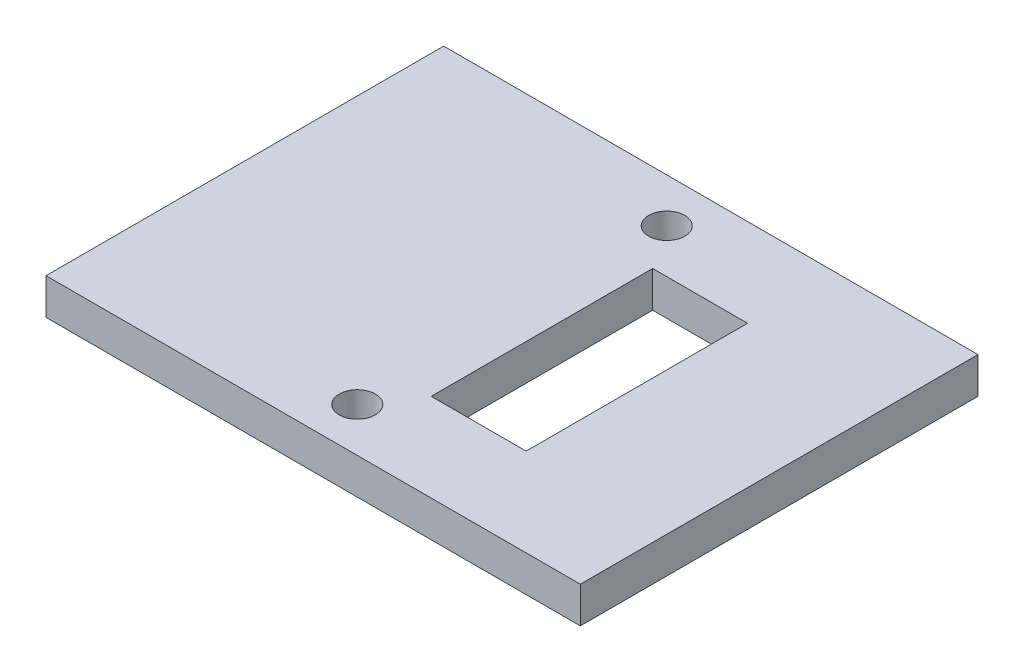
ISO-10303-21;
HEADER;
FILE_DESCRIPTION(('STEP AP214'),'2;1');
FILE_NAME('part.step','',(''),(''),'','','');
FILE_SCHEMA(('AUTOMOTIVE_DESIGN { 1 0 10303 214 1 1 1 1 }'));
ENDSEC;
DATA;
#1=APPLICATION_CONTEXT('core data for automotive mechanical design processes');
#2=APPLICATION_PROTOCOL_DEFINITION('international standard','automotive_design',2000,#1);
#3=PRODUCT_CONTEXT('',#1,'mechanical');
#4=PRODUCT('Part','Part','',(#3));
#5=PRODUCT_RELATED_PRODUCT_CATEGORY('part','',(#4));
#6=PRODUCT_DEFINITION_FORMATION('','',#4);
#7=PRODUCT_DEFINITION_CONTEXT('part definition',#1,'design');
#8=PRODUCT_DEFINITION('design','',#6,#7);
#9=PRODUCT_DEFINITION_SHAPE('','',#8);
#10=(LENGTH_UNIT() NAMED_UNIT(*) SI_UNIT(.MILLI.,.METRE.));
#11=(NAMED_UNIT(*) PLANE_ANGLE_UNIT() SI_UNIT($,.RADIAN.));
#12=(NAMED_UNIT(*) SI_UNIT($,.STERADIAN.) SOLID_ANGLE_UNIT());
#13=UNCERTAINTY_MEASURE_WITH_UNIT(LENGTH_MEASURE(1.E-05),#10,'distance_accuracy_value','');
#14=(GEOMETRIC_REPRESENTATION_CONTEXT(3) GLOBAL_UNCERTAINTY_ASSIGNED_CONTEXT((#13)) GLOBAL_UNIT_ASSIGNED_CONTEXT((#10,
#11,#12)) REPRESENTATION_CONTEXT('',''));
#15=CARTESIAN_POINT('',(0.,0.,0.));
#16=DIRECTION('',(0.,0.,1.));
#17=DIRECTION('',(1.,0.,0.));
#18=AXIS2_PLACEMENT_3D('',#15,#16,#17);
#19=CARTESIAN_POINT('',(4.255,1.,-5.50000000000001));
#20=DIRECTION('',(1.,0.,0.));
#21=DIRECTION('',(0.,0.,-1.));
#22=AXIS2_PLACEMENT_3D('',#19,#20,#21);
#23=PLANE('',#22);
#24=CARTESIAN_POINT('',(4.255,1.,-5.50000000000001));
#25=DIRECTION('',(-1.,0.,0.));
#26=DIRECTION('',(0.,0.,-1.));
#27=AXIS2_PLACEMENT_3D('',#24,#25,#26);
#28=CIRCLE('',#27,0.75);
#29=CARTESIAN_POINT('',(4.255,1.,-6.25000000000001));
#30=VERTEX_POINT('',#29);
#31=EDGE_CURVE('E395',#30,#30,#28,.T.);
#32=ORIENTED_EDGE('',*,*,#31,.T.);
#33=EDGE_LOOP('',(#32));
#34=FACE_BOUND('',#33,.T.);
#35=ADVANCED_FACE('F35',(#34),#23,.F.);
#36=CARTESIAN_POINT('',(4.25499999999999,1.,5.50000000000001));
#37=DIRECTION('',(-1.,0.,0.));
#38=DIRECTION('',(0.,0.,1.));
#39=AXIS2_PLACEMENT_3D('',#36,#37,#38);
#40=PLANE('',#39);
#41=CARTESIAN_POINT('',(4.25499999999999,1.,5.50000000000001));
#42=DIRECTION('',(-1.,0.,0.));
#43=DIRECTION('',(0.,0.,1.));
#44=AXIS2_PLACEMENT_3D('',#41,#42,#43);
#45=CIRCLE('',#44,0.75);
#46=CARTESIAN_POINT('',(4.25499999999999,1.,6.25000000000001));
#47=VERTEX_POINT('',#46);
#48=EDGE_CURVE('E389',#47,#47,#45,.T.);
#49=ORIENTED_EDGE('',*,*,#48,.T.);
#50=EDGE_LOOP('',(#49));
#51=FACE_BOUND('',#50,.T.);
#52=ADVANCED_FACE('F345',(#51),#40,.T.);
#53=CARTESIAN_POINT('',(2.21499999999999,0.,0.));
#54=DIRECTION('',(-1.,0.,0.));
#55=DIRECTION('',(0.,0.,1.));
#56=AXIS2_PLACEMENT_3D('',#53,#54,#55);
#57=PLANE('',#56);
#58=DIRECTION('',(0.,-1.,0.));
#59=VECTOR('',#58,1.);
#60=CARTESIAN_POINT('',(2.21499999999999,0.,-8.12500000000001));
#61=LINE('',#60,#59);
#62=CARTESIAN_POINT('',(2.21499999999999,0.,-8.12500000000001));
#63=VERTEX_POINT('',#62);
#64=CARTESIAN_POINT('',(2.21499999999999,-1.,-8.12500000000001));
#65=VERTEX_POINT('',#64);
#66=EDGE_CURVE('E238',#63,#65,#61,.T.);
#67=ORIENTED_EDGE('',*,*,#66,.F.);
#68=DIRECTION('',(0.,0.,1.));
#69=VECTOR('',#68,1.);
#70=CARTESIAN_POINT('',(2.21499999999999,0.,0.));
#71=LINE('',#70,#69);
#72=CARTESIAN_POINT('',(2.21499999999999,0.,-4.87500000000002));
#73=VERTEX_POINT('',#72);
#74=EDGE_CURVE('E224',#63,#73,#71,.T.);
#75=ORIENTED_EDGE('',*,*,#74,.T.);
#76=DIRECTION('',(0.,1.,0.));
#77=VECTOR('',#76,1.);
#78=CARTESIAN_POINT('',(2.21499999999999,0.,-4.87500000000002));
#79=LINE('',#78,#77);
#80=CARTESIAN_POINT('',(2.21499999999999,-1.,-4.87500000000002));
#81=VERTEX_POINT('',#80);
#82=EDGE_CURVE('E248',#81,#73,#79,.T.);
#83=ORIENTED_EDGE('',*,*,#82,.F.);
#84=DIRECTION('',(0.,0.,1.));
#85=VECTOR('',#84,1.);
#86=CARTESIAN_POINT('',(2.21499999999999,-1.,-8.12500000000001));
#87=LINE('',#86,#85);
#88=EDGE_CURVE('E247',#65,#81,#87,.T.);
#89=ORIENTED_EDGE('',*,*,#88,.F.);
#90=EDGE_LOOP('',(#67,#75,#83,#89));
#91=FACE_BOUND('',#90,.T.);
#92=ADVANCED_FACE('F243',(#91),#57,.F.);
#93=CARTESIAN_POINT('',(2.215,0.,0.));
#94=DIRECTION('',(1.,0.,0.));
#95=DIRECTION('',(0.,0.,-1.));
#96=AXIS2_PLACEMENT_3D('',#93,#94,#95);
#97=PLANE('',#96);
#98=DIRECTION('',(0.,0.,-1.));
#99=VECTOR('',#98,1.);
#100=CARTESIAN_POINT('',(2.215,0.,0.));
#101=LINE('',#100,#99);
#102=CARTESIAN_POINT('',(2.215,0.,8.12500000000001));
#103=VERTEX_POINT('',#102);
#104=CARTESIAN_POINT('',(2.215,0.,4.87500000000002));
#105=VERTEX_POINT('',#104);
#106=EDGE_CURVE('E177',#103,#105,#101,.T.);
#107=ORIENTED_EDGE('',*,*,#106,.F.);
#108=DIRECTION('',(0.,1.,0.));
#109=VECTOR('',#108,1.);
#110=CARTESIAN_POINT('',(2.215,0.,8.12500000000001));
#111=LINE('',#110,#109);
#112=CARTESIAN_POINT('',(2.215,-1.,8.12500000000001));
#113=VERTEX_POINT('',#112);
#114=EDGE_CURVE('E363',#113,#103,#111,.T.);
#115=ORIENTED_EDGE('',*,*,#114,.F.);
#116=DIRECTION('',(0.,0.,1.));
#117=VECTOR('',#116,1.);
#118=CARTESIAN_POINT('',(2.215,-1.,8.12500000000001));
#119=LINE('',#118,#117);
#120=CARTESIAN_POINT('',(2.215,-1.,4.87500000000002));
#121=VERTEX_POINT('',#120);
#122=EDGE_CURVE('E370',#121,#113,#119,.T.);
#123=ORIENTED_EDGE('',*,*,#122,.F.);
#124=DIRECTION('',(0.,-1.,0.));
#125=VECTOR('',#124,1.);
#126=CARTESIAN_POINT('',(2.215,0.,4.87500000000002));
#127=LINE('',#126,#125);
#128=EDGE_CURVE('E369',#105,#121,#127,.T.);
#129=ORIENTED_EDGE('',*,*,#128,.F.);
#130=EDGE_LOOP('',(#107,#115,#123,#129));
#131=FACE_BOUND('',#130,.T.);
#132=ADVANCED_FACE('F309',(#131),#97,.T.);
#133=CARTESIAN_POINT('',(10.69,2.,-6.125));
#134=DIRECTION('',(0.,0.,1.));
#135=DIRECTION('',(1.,0.,0.));
#136=AXIS2_PLACEMENT_3D('',#133,#134,#135);
#137=PLANE('',#136);
#138=DIRECTION('',(1.,0.,0.));
#139=VECTOR('',#138,1.);
#140=CARTESIAN_POINT('',(10.69,2.,-6.125));
#141=LINE('',#140,#139);
#142=CARTESIAN_POINT('',(10.69,2.,-6.125));
#143=VERTEX_POINT('',#142);
#144=CARTESIAN_POINT('',(15.94,2.,-6.125));
#145=VERTEX_POINT('',#144);
#146=EDGE_CURVE('E44',#143,#145,#141,.T.);
#147=ORIENTED_EDGE('',*,*,#146,.F.);
#148=DIRECTION('',(0.,-1.,0.));
#149=VECTOR('',#148,1.);
#150=CARTESIAN_POINT('',(10.69,2.,-6.125));
#151=LINE('',#150,#149);
#152=CARTESIAN_POINT('',(10.69,0.,-6.125));
#153=VERTEX_POINT('',#152);
#154=EDGE_CURVE('E199',#143,#153,#151,.T.);
#155=ORIENTED_EDGE('',*,*,#154,.T.);
#156=DIRECTION('',(-1.,0.,0.));
#157=VECTOR('',#156,1.);
#158=CARTESIAN_POINT('',(10.69,0.,-6.125));
#159=LINE('',#158,#157);
#160=CARTESIAN_POINT('',(15.94,0.,-6.125));
#161=VERTEX_POINT('',#160);
#162=EDGE_CURVE('E200',#161,#153,#159,.T.);
#163=ORIENTED_EDGE('',*,*,#162,.F.);
#164=DIRECTION('',(0.,-1.,0.));
#165=VECTOR('',#164,1.);
#166=CARTESIAN_POINT('',(15.94,2.,-6.125));
#167=LINE('',#166,#165);
#168=EDGE_CURVE('E211',#145,#161,#167,.T.);
#169=ORIENTED_EDGE('',*,*,#168,.F.);
#170=EDGE_LOOP('',(#147,#155,#163,#169));
#171=FACE_BOUND('',#170,.T.);
#172=ADVANCED_FACE('F275',(#171),#137,.T.);
#173=CARTESIAN_POINT('',(10.69,2.,6.125));
#174=DIRECTION('',(0.,0.,-1.));
#175=DIRECTION('',(-1.,0.,0.));
#176=AXIS2_PLACEMENT_3D('',#173,#174,#175);
#177=PLANE('',#176);
#178=DIRECTION('',(-1.,0.,0.));
#179=VECTOR('',#178,1.);
#180=CARTESIAN_POINT('',(10.69,2.,6.125));
#181=LINE('',#180,#179);
#182=CARTESIAN_POINT('',(15.94,2.,6.125));
#183=VERTEX_POINT('',#182);
#184=CARTESIAN_POINT('',(10.69,2.,6.125));
#185=VERTEX_POINT('',#184);
#186=EDGE_CURVE('E186',#183,#185,#181,.T.);
#187=ORIENTED_EDGE('',*,*,#186,.F.);
#188=DIRECTION('',(0.,-1.,0.));
#189=VECTOR('',#188,1.);
#190=CARTESIAN_POINT('',(15.94,2.,6.125));
#191=LINE('',#190,#189);
#192=CARTESIAN_POINT('',(15.94,0.,6.125));
#193=VERTEX_POINT('',#192);
#194=EDGE_CURVE('E206',#183,#193,#191,.T.);
#195=ORIENTED_EDGE('',*,*,#194,.T.);
#196=DIRECTION('',(1.,0.,0.));
#197=VECTOR('',#196,1.);
#198=CARTESIAN_POINT('',(10.69,0.,6.125));
#199=LINE('',#198,#197);
#200=CARTESIAN_POINT('',(10.69,0.,6.125));
#201=VERTEX_POINT('',#200);
#202=EDGE_CURVE('E204',#201,#193,#199,.T.);
#203=ORIENTED_EDGE('',*,*,#202,.F.);
#204=DIRECTION('',(0.,-1.,0.));
#205=VECTOR('',#204,1.);
#206=CARTESIAN_POINT('',(10.69,2.,6.125));
#207=LINE('',#206,#205);
#208=EDGE_CURVE('E197',#185,#201,#207,.T.);
#209=ORIENTED_EDGE('',*,*,#208,.F.);
#210=EDGE_LOOP('',(#187,#195,#203,#209));
#211=FACE_BOUND('',#210,.T.);
#212=ADVANCED_FACE('F202',(#211),#177,.T.);
#213=CARTESIAN_POINT('',(4.255,1.,-5.50000000000001));
#214=DIRECTION('',(-1.,0.,0.));
#215=DIRECTION('',(0.,0.,1.));
#216=AXIS2_PLACEMENT_3D('',#213,#214,#215);
#217=CYLINDRICAL_SURFACE('',#216,0.75);
#218=ORIENTED_EDGE('',*,*,#31,.F.);
#219=EDGE_LOOP('',(#218));
#220=FACE_BOUND('',#219,.T.);
#221=CARTESIAN_POINT('',(-5.745,1.,-5.50000000000001));
#222=DIRECTION('',(-1.,0.,0.));
#223=DIRECTION('',(0.,0.,-1.));
#224=AXIS2_PLACEMENT_3D('',#221,#222,#223);
#225=CIRCLE('',#224,0.75);
#226=CARTESIAN_POINT('',(-5.745,1.,-6.25000000000001));
#227=VERTEX_POINT('',#226);
#228=EDGE_CURVE('E388',#227,#227,#225,.T.);
#229=ORIENTED_EDGE('',*,*,#228,.T.);
#230=EDGE_LOOP('',(#229));
#231=FACE_BOUND('',#230,.T.);
#232=ADVANCED_FACE('F314',(#220,#231),#217,.F.);
#233=CARTESIAN_POINT('',(4.25499999999999,1.,5.50000000000001));
#234=DIRECTION('',(-1.,0.,0.));
#235=DIRECTION('',(0.,0.,1.));
#236=AXIS2_PLACEMENT_3D('',#233,#234,#235);
#237=CYLINDRICAL_SURFACE('',#236,0.75);
#238=ORIENTED_EDGE('',*,*,#48,.F.);
#239=EDGE_LOOP('',(#238));
#240=FACE_BOUND('',#239,.T.);
#241=CARTESIAN_POINT('',(-5.74500000000001,1.,5.50000000000001));
#242=DIRECTION('',(-1.,0.,0.));
#243=DIRECTION('',(0.,0.,1.));
#244=AXIS2_PLACEMENT_3D('',#241,#242,#243);
#245=CIRCLE('',#244,0.75);
#246=CARTESIAN_POINT('',(-5.74500000000001,1.,6.25000000000001));
#247=VERTEX_POINT('',#246);
#248=EDGE_CURVE('E392',#247,#247,#245,.T.);
#249=ORIENTED_EDGE('',*,*,#248,.T.);
#250=EDGE_LOOP('',(#249));
#251=FACE_BOUND('',#250,.T.);
#252=ADVANCED_FACE('F318',(#240,#251),#237,.F.);
#253=CARTESIAN_POINT('',(23.815,2.,11.));
#254=DIRECTION('',(0.,0.,-1.));
#255=DIRECTION('',(-1.,0.,0.));
#256=AXIS2_PLACEMENT_3D('',#253,#254,#255);
#257=PLANE('',#256);
#258=DIRECTION('',(0.,-1.,0.));
#259=VECTOR('',#258,1.);
#260=CARTESIAN_POINT('',(23.815,2.,11.));
#261=LINE('',#260,#259);
#262=CARTESIAN_POINT('',(23.815,2.,11.));
#263=VERTEX_POINT('',#262);
#264=CARTESIAN_POINT('',(23.815,0.,11.));
#265=VERTEX_POINT('',#264);
#266=EDGE_CURVE('E222',#263,#265,#261,.T.);
#267=ORIENTED_EDGE('',*,*,#266,.F.);
#268=DIRECTION('',(-1.,0.,0.));
#269=VECTOR('',#268,1.);
#270=CARTESIAN_POINT('',(23.815,2.,11.));
#271=LINE('',#270,#269);
#272=CARTESIAN_POINT('',(-5.74500000000001,2.,11.));
#273=VERTEX_POINT('',#272);
#274=EDGE_CURVE('E181',#263,#273,#271,.T.);
#275=ORIENTED_EDGE('',*,*,#274,.T.);
#276=DIRECTION('',(0.,-1.,0.));
#277=VECTOR('',#276,1.);
#278=CARTESIAN_POINT('',(-5.74500000000001,7.5,11.));
#279=LINE('',#278,#277);
#280=CARTESIAN_POINT('',(-5.74500000000001,0.,11.));
#281=VERTEX_POINT('',#280);
#282=EDGE_CURVE('E373',#273,#281,#279,.T.);
#283=ORIENTED_EDGE('',*,*,#282,.T.);
#284=DIRECTION('',(1.,0.,0.));
#285=VECTOR('',#284,1.);
#286=CARTESIAN_POINT('',(23.815,0.,11.));
#287=LINE('',#286,#285);
#288=EDGE_CURVE('E205',#281,#265,#287,.T.);
#289=ORIENTED_EDGE('',*,*,#288,.T.);
#290=EDGE_LOOP('',(#267,#275,#283,#289));
#291=FACE_BOUND('',#290,.T.);
#292=ADVANCED_FACE('F37',(#291),#257,.F.);
#293=CARTESIAN_POINT('',(-25.815,2.,8.125));
#294=DIRECTION('',(0.,0.,-1.));
#295=DIRECTION('',(-1.,0.,0.));
#296=AXIS2_PLACEMENT_3D('',#293,#294,#295);
#297=PLANE('',#296);
#298=DIRECTION('',(1.,0.,0.));
#299=VECTOR('',#298,1.);
#300=CARTESIAN_POINT('',(0.,0.,8.12500000000001));
#301=LINE('',#300,#299);
#302=CARTESIAN_POINT('',(-5.74500000000001,0.,8.12499999999999));
#303=VERTEX_POINT('',#302);
#304=EDGE_CURVE('E178',#303,#103,#301,.T.);
#305=ORIENTED_EDGE('',*,*,#304,.F.);
#306=DIRECTION('',(0.,-1.,0.));
#307=VECTOR('',#306,1.);
#308=CARTESIAN_POINT('',(-5.74500000000001,2.,8.12499999999999));
#309=LINE('',#308,#307);
#310=CARTESIAN_POINT('',(-5.74500000000001,-1.,8.12500000000002));
#311=VERTEX_POINT('',#310);
#312=EDGE_CURVE('E360',#303,#311,#309,.T.);
#313=ORIENTED_EDGE('',*,*,#312,.T.);
#314=DIRECTION('',(-1.,0.,0.));
#315=VECTOR('',#314,1.);
#316=CARTESIAN_POINT('',(2.215,-1.,8.12500000000001));
#317=LINE('',#316,#315);
#318=EDGE_CURVE('E252',#113,#311,#317,.T.);
#319=ORIENTED_EDGE('',*,*,#318,.F.);
#320=ORIENTED_EDGE('',*,*,#114,.T.);
#321=EDGE_LOOP('',(#305,#313,#319,#320));
#322=FACE_BOUND('',#321,.T.);
#323=ADVANCED_FACE('F338',(#322),#297,.F.);
#324=CARTESIAN_POINT('',(2.215,-1.,8.12500000000001));
#325=DIRECTION('',(0.,-1.,0.));
#326=DIRECTION('',(0.,0.,-1.));
#327=AXIS2_PLACEMENT_3D('',#324,#325,#326);
#328=PLANE('',#327);
#329=DIRECTION('',(0.,0.,-1.));
#330=VECTOR('',#329,1.);
#331=CARTESIAN_POINT('',(-5.74500000000001,-1.,0.));
#332=LINE('',#331,#330);
#333=CARTESIAN_POINT('',(-5.74500000000001,-1.,4.87500000000002));
#334=VERTEX_POINT('',#333);
#335=EDGE_CURVE('E160',#311,#334,#332,.T.);
#336=ORIENTED_EDGE('',*,*,#335,.T.);
#337=DIRECTION('',(-1.,0.,0.));
#338=VECTOR('',#337,1.);
#339=CARTESIAN_POINT('',(2.215,-1.,4.87500000000002));
#340=LINE('',#339,#338);
#341=EDGE_CURVE('E156',#121,#334,#340,.T.);
#342=ORIENTED_EDGE('',*,*,#341,.F.);
#343=ORIENTED_EDGE('',*,*,#122,.T.);
#344=ORIENTED_EDGE('',*,*,#318,.T.);
#345=EDGE_LOOP('',(#336,#342,#343,#344));
#346=FACE_BOUND('',#345,.T.);
#347=ADVANCED_FACE('F335',(#346),#328,.T.);
#348=CARTESIAN_POINT('',(2.215,0.,4.87500000000002));
#349=DIRECTION('',(0.,0.,-1.));
#350=DIRECTION('',(-1.,0.,0.));
#351=AXIS2_PLACEMENT_3D('',#348,#349,#350);
#352=PLANE('',#351);
#353=DIRECTION('',(0.,-1.,0.));
#354=VECTOR('',#353,1.);
#355=CARTESIAN_POINT('',(-5.74500000000001,0.,4.87500000000002));
#356=LINE('',#355,#354);
#357=CARTESIAN_POINT('',(-5.74500000000001,0.,4.87500000000002));
#358=VERTEX_POINT('',#357);
#359=EDGE_CURVE('E149',#358,#334,#356,.T.);
#360=ORIENTED_EDGE('',*,*,#359,.F.);
#361=DIRECTION('',(-1.,0.,0.));
#362=VECTOR('',#361,1.);
#363=CARTESIAN_POINT('',(0.,0.,4.87500000000002));
#364=LINE('',#363,#362);
#365=EDGE_CURVE('E153',#105,#358,#364,.T.);
#366=ORIENTED_EDGE('',*,*,#365,.F.);
#367=ORIENTED_EDGE('',*,*,#128,.T.);
#368=ORIENTED_EDGE('',*,*,#341,.T.);
#369=EDGE_LOOP('',(#360,#366,#367,#368));
#370=FACE_BOUND('',#369,.T.);
#371=ADVANCED_FACE('F151',(#370),#352,.T.);
#372=CARTESIAN_POINT('',(2.21499999999999,0.,-4.87500000000002));
#373=DIRECTION('',(0.,0.,1.));
#374=DIRECTION('',(1.,0.,0.));
#375=AXIS2_PLACEMENT_3D('',#372,#373,#374);
#376=PLANE('',#375);
#377=DIRECTION('',(0.,1.,0.));
#378=VECTOR('',#377,1.);
#379=CARTESIAN_POINT('',(-5.74500000000001,0.,-4.87500000000002));
#380=LINE('',#379,#378);
#381=CARTESIAN_POINT('',(-5.745,-1.,-4.87500000000001));
#382=VERTEX_POINT('',#381);
#383=CARTESIAN_POINT('',(-5.745,0.,-4.87500000000002));
#384=VERTEX_POINT('',#383);
#385=EDGE_CURVE('E159',#382,#384,#380,.T.);
#386=ORIENTED_EDGE('',*,*,#385,.F.);
#387=DIRECTION('',(-1.,0.,0.));
#388=VECTOR('',#387,1.);
#389=CARTESIAN_POINT('',(2.21499999999999,-1.,-4.87500000000002));
#390=LINE('',#389,#388);
#391=EDGE_CURVE('E256',#81,#382,#390,.T.);
#392=ORIENTED_EDGE('',*,*,#391,.F.);
#393=ORIENTED_EDGE('',*,*,#82,.T.);
#394=DIRECTION('',(1.,0.,0.));
#395=VECTOR('',#394,1.);
#396=CARTESIAN_POINT('',(0.,0.,-4.87500000000002));
#397=LINE('',#396,#395);
#398=EDGE_CURVE('E227',#384,#73,#397,.T.);
#399=ORIENTED_EDGE('',*,*,#398,.F.);
#400=EDGE_LOOP('',(#386,#392,#393,#399));
#401=FACE_BOUND('',#400,.T.);
#402=ADVANCED_FACE('F342',(#401),#376,.T.);
#403=CARTESIAN_POINT('',(2.21499999999999,-1.,-8.12500000000001));
#404=DIRECTION('',(0.,-1.,0.));
#405=DIRECTION('',(0.,0.,-1.));
#406=AXIS2_PLACEMENT_3D('',#403,#404,#405);
#407=PLANE('',#406);
#408=CARTESIAN_POINT('',(-5.745,-1.,-8.12500000000001));
#409=VERTEX_POINT('',#408);
#410=EDGE_CURVE('E377',#382,#409,#332,.T.);
#411=ORIENTED_EDGE('',*,*,#410,.T.);
#412=DIRECTION('',(-1.,0.,0.));
#413=VECTOR('',#412,1.);
#414=CARTESIAN_POINT('',(2.21499999999999,-1.,-8.12500000000001));
#415=LINE('',#414,#413);
#416=EDGE_CURVE('E250',#65,#409,#415,.T.);
#417=ORIENTED_EDGE('',*,*,#416,.F.);
#418=ORIENTED_EDGE('',*,*,#88,.T.);
#419=ORIENTED_EDGE('',*,*,#391,.T.);
#420=EDGE_LOOP('',(#411,#417,#418,#419));
#421=FACE_BOUND('',#420,.T.);
#422=ADVANCED_FACE('F287',(#421),#407,.T.);
#423=CARTESIAN_POINT('',(-25.815,2.,-8.125));
#424=DIRECTION('',(0.,0.,1.));
#425=DIRECTION('',(1.,0.,0.));
#426=AXIS2_PLACEMENT_3D('',#423,#424,#425);
#427=PLANE('',#426);
#428=ORIENTED_EDGE('',*,*,#416,.T.);
#429=DIRECTION('',(0.,1.,0.));
#430=VECTOR('',#429,1.);
#431=CARTESIAN_POINT('',(-5.74500000000001,2.,-8.12500000000001));
#432=LINE('',#431,#430);
#433=CARTESIAN_POINT('',(-5.745,0.,-8.12500000000001));
#434=VERTEX_POINT('',#433);
#435=EDGE_CURVE('E240',#409,#434,#432,.T.);
#436=ORIENTED_EDGE('',*,*,#435,.T.);
#437=DIRECTION('',(-1.,0.,0.));
#438=VECTOR('',#437,1.);
#439=CARTESIAN_POINT('',(0.,0.,-8.12500000000001));
#440=LINE('',#439,#438);
#441=EDGE_CURVE('E229',#63,#434,#440,.T.);
#442=ORIENTED_EDGE('',*,*,#441,.F.);
#443=ORIENTED_EDGE('',*,*,#66,.T.);
#444=EDGE_LOOP('',(#428,#436,#442,#443));
#445=FACE_BOUND('',#444,.T.);
#446=ADVANCED_FACE('F237',(#445),#427,.F.);
#447=CARTESIAN_POINT('',(0.,0.,0.));
#448=DIRECTION('',(0.,1.,0.));
#449=DIRECTION('',(0.,0.,1.));
#450=AXIS2_PLACEMENT_3D('',#447,#448,#449);
#451=PLANE('',#450);
#452=CARTESIAN_POINT('',(9.035,0.,8.56000000000001));
#453=DIRECTION('',(0.,-1.,0.));
#454=DIRECTION('',(0.,0.,-1.));
#455=AXIS2_PLACEMENT_3D('',#452,#453,#454);
#456=CIRCLE('',#455,1.);
#457=CARTESIAN_POINT('',(9.035,0.,7.56000000000001));
#458=VERTEX_POINT('',#457);
#459=EDGE_CURVE('E679',#458,#458,#456,.T.);
#460=ORIENTED_EDGE('',*,*,#459,.F.);
#461=EDGE_LOOP('',(#460));
#462=FACE_BOUND('',#461,.T.);
#463=CARTESIAN_POINT('',(9.035,0.,-8.56000000000001));
#464=DIRECTION('',(0.,-1.,0.));
#465=DIRECTION('',(0.,0.,-1.));
#466=AXIS2_PLACEMENT_3D('',#463,#464,#465);
#467=CIRCLE('',#466,1.);
#468=CARTESIAN_POINT('',(9.035,0.,-9.56000000000001));
#469=VERTEX_POINT('',#468);
#470=EDGE_CURVE('E382',#469,#469,#467,.T.);
#471=ORIENTED_EDGE('',*,*,#470,.F.);
#472=EDGE_LOOP('',(#471));
#473=FACE_BOUND('',#472,.T.);
#474=DIRECTION('',(0.,0.,1.));
#475=VECTOR('',#474,1.);
#476=CARTESIAN_POINT('',(10.69,0.,-6.125));
#477=LINE('',#476,#475);
#478=EDGE_CURVE('E261',#153,#201,#477,.T.);
#479=ORIENTED_EDGE('',*,*,#478,.T.);
#480=ORIENTED_EDGE('',*,*,#202,.T.);
#481=DIRECTION('',(0.,0.,-1.));
#482=VECTOR('',#481,1.);
#483=CARTESIAN_POINT('',(15.94,0.,-6.125));
#484=LINE('',#483,#482);
#485=EDGE_CURVE('E266',#193,#161,#484,.T.);
#486=ORIENTED_EDGE('',*,*,#485,.T.);
#487=ORIENTED_EDGE('',*,*,#162,.T.);
#488=EDGE_LOOP('',(#479,#480,#486,#487));
#489=FACE_BOUND('',#488,.T.);
#490=DIRECTION('',(0.,0.,-1.));
#491=VECTOR('',#490,1.);
#492=CARTESIAN_POINT('',(-5.74500000000001,0.,11.));
#493=LINE('',#492,#491);
#494=CARTESIAN_POINT('',(-5.745,0.,-11.));
#495=VERTEX_POINT('',#494);
#496=EDGE_CURVE('E171',#434,#495,#493,.T.);
#497=ORIENTED_EDGE('',*,*,#496,.T.);
#498=DIRECTION('',(-1.,0.,0.));
#499=VECTOR('',#498,1.);
#500=CARTESIAN_POINT('',(23.815,0.,-11.));
#501=LINE('',#500,#499);
#502=CARTESIAN_POINT('',(23.815,0.,-11.));
#503=VERTEX_POINT('',#502);
#504=EDGE_CURVE('E217',#503,#495,#501,.T.);
#505=ORIENTED_EDGE('',*,*,#504,.F.);
#506=DIRECTION('',(0.,0.,-1.));
#507=VECTOR('',#506,1.);
#508=CARTESIAN_POINT('',(23.815,0.,11.));
#509=LINE('',#508,#507);
#510=EDGE_CURVE('E209',#265,#503,#509,.T.);
#511=ORIENTED_EDGE('',*,*,#510,.F.);
#512=ORIENTED_EDGE('',*,*,#288,.F.);
#513=EDGE_CURVE('E170',#281,#303,#493,.T.);
#514=ORIENTED_EDGE('',*,*,#513,.T.);
#515=ORIENTED_EDGE('',*,*,#304,.T.);
#516=ORIENTED_EDGE('',*,*,#106,.T.);
#517=ORIENTED_EDGE('',*,*,#365,.T.);
#518=EDGE_CURVE('E163',#358,#384,#493,.T.);
#519=ORIENTED_EDGE('',*,*,#518,.T.);
#520=ORIENTED_EDGE('',*,*,#398,.T.);
#521=ORIENTED_EDGE('',*,*,#74,.F.);
#522=ORIENTED_EDGE('',*,*,#441,.T.);
#523=EDGE_LOOP('',(#497,#505,#511,#512,#514,#515,#516,#517,#519,#520,#521,#522));
#524=FACE_BOUND('',#523,.T.);
#525=ADVANCED_FACE('F175',(#462,#473,#489,#524),#451,.F.);
#526=CARTESIAN_POINT('',(23.815,2.,-11.));
#527=DIRECTION('',(0.,0.,1.));
#528=DIRECTION('',(1.,0.,0.));
#529=AXIS2_PLACEMENT_3D('',#526,#527,#528);
#530=PLANE('',#529);
#531=DIRECTION('',(0.,-1.,0.));
#532=VECTOR('',#531,1.);
#533=CARTESIAN_POINT('',(-5.745,7.5,-11.));
#534=LINE('',#533,#532);
#535=CARTESIAN_POINT('',(-5.745,2.,-11.));
#536=VERTEX_POINT('',#535);
#537=EDGE_CURVE('E400',#536,#495,#534,.T.);
#538=ORIENTED_EDGE('',*,*,#537,.F.);
#539=DIRECTION('',(1.,0.,0.));
#540=VECTOR('',#539,1.);
#541=CARTESIAN_POINT('',(23.815,2.,-11.));
#542=LINE('',#541,#540);
#543=CARTESIAN_POINT('',(23.815,2.,-11.));
#544=VERTEX_POINT('',#543);
#545=EDGE_CURVE('E39',#536,#544,#542,.T.);
#546=ORIENTED_EDGE('',*,*,#545,.T.);
#547=DIRECTION('',(0.,-1.,0.));
#548=VECTOR('',#547,1.);
#549=CARTESIAN_POINT('',(23.815,2.,-11.));
#550=LINE('',#549,#548);
#551=EDGE_CURVE('E220',#544,#503,#550,.T.);
#552=ORIENTED_EDGE('',*,*,#551,.T.);
#553=ORIENTED_EDGE('',*,*,#504,.T.);
#554=EDGE_LOOP('',(#538,#546,#552,#553));
#555=FACE_BOUND('',#554,.T.);
#556=ADVANCED_FACE('F278',(#555),#530,.F.);
#557=CARTESIAN_POINT('',(-5.74500000000001,7.5,11.));
#558=DIRECTION('',(-1.,0.,0.));
#559=DIRECTION('',(0.,0.,1.));
#560=AXIS2_PLACEMENT_3D('',#557,#558,#559);
#561=PLANE('',#560);
#562=DIRECTION('',(0.,0.,1.));
#563=VECTOR('',#562,1.);
#564=CARTESIAN_POINT('',(-5.74500000000001,2.,11.));
#565=LINE('',#564,#563);
#566=EDGE_CURVE('E11',#536,#273,#565,.T.);
#567=ORIENTED_EDGE('',*,*,#566,.F.);
#568=ORIENTED_EDGE('',*,*,#537,.T.);
#569=ORIENTED_EDGE('',*,*,#496,.F.);
#570=ORIENTED_EDGE('',*,*,#435,.F.);
#571=ORIENTED_EDGE('',*,*,#410,.F.);
#572=ORIENTED_EDGE('',*,*,#385,.T.);
#573=ORIENTED_EDGE('',*,*,#518,.F.);
#574=ORIENTED_EDGE('',*,*,#359,.T.);
#575=ORIENTED_EDGE('',*,*,#335,.F.);
#576=ORIENTED_EDGE('',*,*,#312,.F.);
#577=ORIENTED_EDGE('',*,*,#513,.F.);
#578=ORIENTED_EDGE('',*,*,#282,.F.);
#579=EDGE_LOOP('',(#567,#568,#569,#570,#571,#572,#573,#574,#575,#576,#577,#578));
#580=FACE_BOUND('',#579,.T.);
#581=ORIENTED_EDGE('',*,*,#248,.F.);
#582=EDGE_LOOP('',(#581));
#583=FACE_BOUND('',#582,.T.);
#584=ORIENTED_EDGE('',*,*,#228,.F.);
#585=EDGE_LOOP('',(#584));
#586=FACE_BOUND('',#585,.T.);
#587=ADVANCED_FACE('F165',(#580,#583,#586),#561,.T.);
#588=CARTESIAN_POINT('',(23.815,2.,11.));
#589=DIRECTION('',(-1.,0.,0.));
#590=DIRECTION('',(0.,0.,1.));
#591=AXIS2_PLACEMENT_3D('',#588,#589,#590);
#592=PLANE('',#591);
#593=ORIENTED_EDGE('',*,*,#551,.F.);
#594=DIRECTION('',(0.,0.,1.));
#595=VECTOR('',#594,1.);
#596=CARTESIAN_POINT('',(23.815,2.,-6.125));
#597=LINE('',#596,#595);
#598=EDGE_CURVE('E259',#544,#263,#597,.T.);
#599=ORIENTED_EDGE('',*,*,#598,.T.);
#600=ORIENTED_EDGE('',*,*,#266,.T.);
#601=ORIENTED_EDGE('',*,*,#510,.T.);
#602=EDGE_LOOP('',(#593,#599,#600,#601));
#603=FACE_BOUND('',#602,.T.);
#604=ADVANCED_FACE('F312',(#603),#592,.F.);
#605=CARTESIAN_POINT('',(15.94,2.,-6.125));
#606=DIRECTION('',(-1.,0.,0.));
#607=DIRECTION('',(0.,0.,1.));
#608=AXIS2_PLACEMENT_3D('',#605,#606,#607);
#609=PLANE('',#608);
#610=ORIENTED_EDGE('',*,*,#485,.F.);
#611=ORIENTED_EDGE('',*,*,#194,.F.);
#612=DIRECTION('',(0.,0.,-1.));
#613=VECTOR('',#612,1.);
#614=CARTESIAN_POINT('',(15.94,2.,-6.125));
#615=LINE('',#614,#613);
#616=EDGE_CURVE('E190',#183,#145,#615,.T.);
#617=ORIENTED_EDGE('',*,*,#616,.T.);
#618=ORIENTED_EDGE('',*,*,#168,.T.);
#619=EDGE_LOOP('',(#610,#611,#617,#618));
#620=FACE_BOUND('',#619,.T.);
#621=ADVANCED_FACE('F274',(#620),#609,.T.);
#622=CARTESIAN_POINT('',(10.69,2.,-6.125));
#623=DIRECTION('',(1.,0.,0.));
#624=DIRECTION('',(0.,0.,-1.));
#625=AXIS2_PLACEMENT_3D('',#622,#623,#624);
#626=PLANE('',#625);
#627=ORIENTED_EDGE('',*,*,#478,.F.);
#628=ORIENTED_EDGE('',*,*,#154,.F.);
#629=DIRECTION('',(0.,0.,1.));
#630=VECTOR('',#629,1.);
#631=CARTESIAN_POINT('',(10.69,2.,-6.125));
#632=LINE('',#631,#630);
#633=EDGE_CURVE('E189',#143,#185,#632,.T.);
#634=ORIENTED_EDGE('',*,*,#633,.T.);
#635=ORIENTED_EDGE('',*,*,#208,.T.);
#636=EDGE_LOOP('',(#627,#628,#634,#635));
#637=FACE_BOUND('',#636,.T.);
#638=ADVANCED_FACE('F196',(#637),#626,.T.);
#639=CARTESIAN_POINT('',(0.,2.,0.));
#640=DIRECTION('',(0.,1.,0.));
#641=DIRECTION('',(0.,0.,1.));
#642=AXIS2_PLACEMENT_3D('',#639,#640,#641);
#643=PLANE('',#642);
#644=CARTESIAN_POINT('',(9.035,2.,8.56000000000001));
#645=DIRECTION('',(0.,-1.,0.));
#646=DIRECTION('',(0.,0.,-1.));
#647=AXIS2_PLACEMENT_3D('',#644,#645,#646);
#648=CIRCLE('',#647,1.);
#649=CARTESIAN_POINT('',(9.035,2.,7.56000000000001));
#650=VERTEX_POINT('',#649);
#651=EDGE_CURVE('E380',#650,#650,#648,.T.);
#652=ORIENTED_EDGE('',*,*,#651,.T.);
#653=EDGE_LOOP('',(#652));
#654=FACE_BOUND('',#653,.T.);
#655=CARTESIAN_POINT('',(9.035,2.,-8.56000000000001));
#656=DIRECTION('',(0.,-1.,0.));
#657=DIRECTION('',(0.,0.,-1.));
#658=AXIS2_PLACEMENT_3D('',#655,#656,#657);
#659=CIRCLE('',#658,1.);
#660=CARTESIAN_POINT('',(9.035,2.,-9.56000000000001));
#661=VERTEX_POINT('',#660);
#662=EDGE_CURVE('E680',#661,#661,#659,.T.);
#663=ORIENTED_EDGE('',*,*,#662,.T.);
#664=EDGE_LOOP('',(#663));
#665=FACE_BOUND('',#664,.T.);
#666=ORIENTED_EDGE('',*,*,#598,.F.);
#667=ORIENTED_EDGE('',*,*,#545,.F.);
#668=ORIENTED_EDGE('',*,*,#566,.T.);
#669=ORIENTED_EDGE('',*,*,#274,.F.);
#670=EDGE_LOOP('',(#666,#667,#668,#669));
#671=FACE_BOUND('',#670,.T.);
#672=ORIENTED_EDGE('',*,*,#633,.F.);
#673=ORIENTED_EDGE('',*,*,#146,.T.);
#674=ORIENTED_EDGE('',*,*,#616,.F.);
#675=ORIENTED_EDGE('',*,*,#186,.T.);
#676=EDGE_LOOP('',(#672,#673,#674,#675));
#677=FACE_BOUND('',#676,.T.);
#678=ADVANCED_FACE('F188',(#654,#665,#671,#677),#643,.T.);
#679=CARTESIAN_POINT('',(9.035,2.,-8.56000000000001));
#680=DIRECTION('',(0.,-1.,0.));
#681=DIRECTION('',(0.,0.,-1.));
#682=AXIS2_PLACEMENT_3D('',#679,#680,#681);
#683=CYLINDRICAL_SURFACE('',#682,1.);
#684=ORIENTED_EDGE('',*,*,#662,.F.);
#685=EDGE_LOOP('',(#684));
#686=FACE_BOUND('',#685,.T.);
#687=ORIENTED_EDGE('',*,*,#470,.T.);
#688=EDGE_LOOP('',(#687));
#689=FACE_BOUND('',#688,.T.);
#690=ADVANCED_FACE('F293',(#686,#689),#683,.F.);
#691=CARTESIAN_POINT('',(9.035,2.,8.56000000000001));
#692=DIRECTION('',(0.,-1.,0.));
#693=DIRECTION('',(0.,0.,-1.));
#694=AXIS2_PLACEMENT_3D('',#691,#692,#693);
#695=CYLINDRICAL_SURFACE('',#694,1.);
#696=ORIENTED_EDGE('',*,*,#651,.F.);
#697=EDGE_LOOP('',(#696));
#698=FACE_BOUND('',#697,.T.);
#699=ORIENTED_EDGE('',*,*,#459,.T.);
#700=EDGE_LOOP('',(#699));
#701=FACE_BOUND('',#700,.T.);
#702=ADVANCED_FACE('F300',(#698,#701),#695,.F.);
#703=CLOSED_SHELL('',(#35,#52,#92,#132,#172,#212,#232,#252,#292,#323,#347,#371,#402,#422,#446,
#525,#556,#587,#604,#621,#638,#678,#690,#702));
#704=MANIFOLD_SOLID_BREP('B2',#703);
#705=ADVANCED_BREP_SHAPE_REPRESENTATION('',(#18,#704),#14);
#706=SHAPE_DEFINITION_REPRESENTATION(#9,#705);
ENDSEC;
END-ISO-10303-21;
